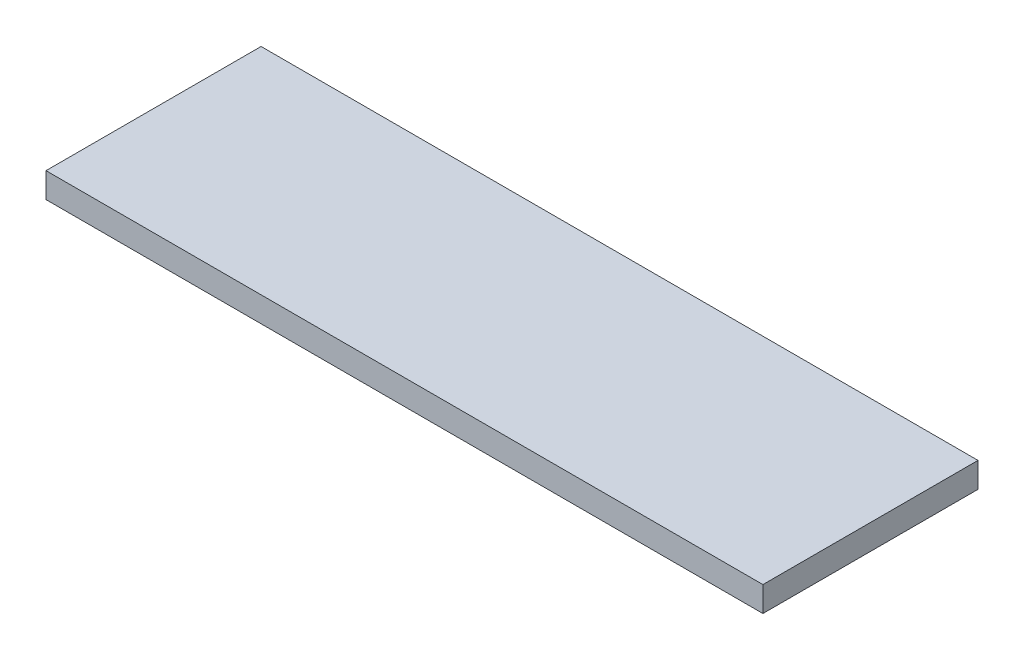
ISO-10303-21;
HEADER;
FILE_DESCRIPTION(('STEP AP214'),'2;1');
FILE_NAME('part.step','',(''),(''),'','','');
FILE_SCHEMA(('AUTOMOTIVE_DESIGN { 1 0 10303 214 1 1 1 1 }'));
ENDSEC;
DATA;
#1=APPLICATION_CONTEXT('core data for automotive mechanical design processes');
#2=APPLICATION_PROTOCOL_DEFINITION('international standard','automotive_design',2000,#1);
#3=PRODUCT_CONTEXT('',#1,'mechanical');
#4=PRODUCT('Part','Part','',(#3));
#5=PRODUCT_RELATED_PRODUCT_CATEGORY('part','',(#4));
#6=PRODUCT_DEFINITION_FORMATION('','',#4);
#7=PRODUCT_DEFINITION_CONTEXT('part definition',#1,'design');
#8=PRODUCT_DEFINITION('design','',#6,#7);
#9=PRODUCT_DEFINITION_SHAPE('','',#8);
#10=(LENGTH_UNIT() NAMED_UNIT(*) SI_UNIT(.MILLI.,.METRE.));
#11=(NAMED_UNIT(*) PLANE_ANGLE_UNIT() SI_UNIT($,.RADIAN.));
#12=(NAMED_UNIT(*) SI_UNIT($,.STERADIAN.) SOLID_ANGLE_UNIT());
#13=UNCERTAINTY_MEASURE_WITH_UNIT(LENGTH_MEASURE(1.E-05),#10,'distance_accuracy_value','');
#14=(GEOMETRIC_REPRESENTATION_CONTEXT(3) GLOBAL_UNCERTAINTY_ASSIGNED_CONTEXT((#13)) GLOBAL_UNIT_ASSIGNED_CONTEXT((#10,
#11,#12)) REPRESENTATION_CONTEXT('',''));
#15=CARTESIAN_POINT('',(0.,0.,0.));
#16=DIRECTION('',(0.,0.,1.));
#17=DIRECTION('',(1.,0.,0.));
#18=AXIS2_PLACEMENT_3D('',#15,#16,#17);
#19=CARTESIAN_POINT('',(63.5,2.2225,19.05));
#20=DIRECTION('',(-1.,0.,0.));
#21=DIRECTION('',(0.,0.,1.));
#22=AXIS2_PLACEMENT_3D('',#19,#20,#21);
#23=PLANE('',#22);
#24=DIRECTION('',(0.,0.,-1.));
#25=VECTOR('',#24,1.);
#26=CARTESIAN_POINT('',(63.5,-2.2225,19.05));
#27=LINE('',#26,#25);
#28=CARTESIAN_POINT('',(63.5,-2.2225,19.05));
#29=VERTEX_POINT('',#28);
#30=CARTESIAN_POINT('',(63.5,-2.2225,-19.05));
#31=VERTEX_POINT('',#30);
#32=EDGE_CURVE('E95',#29,#31,#27,.T.);
#33=ORIENTED_EDGE('',*,*,#32,.T.);
#34=DIRECTION('',(0.,-1.,0.));
#35=VECTOR('',#34,1.);
#36=CARTESIAN_POINT('',(63.5,2.2225,-19.05));
#37=LINE('',#36,#35);
#38=CARTESIAN_POINT('',(63.5,2.2225,-19.05));
#39=VERTEX_POINT('',#38);
#40=EDGE_CURVE('E11',#39,#31,#37,.T.);
#41=ORIENTED_EDGE('',*,*,#40,.F.);
#42=DIRECTION('',(0.,0.,-1.));
#43=VECTOR('',#42,1.);
#44=CARTESIAN_POINT('',(63.5,2.2225,19.05));
#45=LINE('',#44,#43);
#46=CARTESIAN_POINT('',(63.5,2.2225,19.05));
#47=VERTEX_POINT('',#46);
#48=EDGE_CURVE('E83',#47,#39,#45,.T.);
#49=ORIENTED_EDGE('',*,*,#48,.F.);
#50=DIRECTION('',(0.,-1.,0.));
#51=VECTOR('',#50,1.);
#52=CARTESIAN_POINT('',(63.5,2.2225,19.05));
#53=LINE('',#52,#51);
#54=EDGE_CURVE('E91',#47,#29,#53,.T.);
#55=ORIENTED_EDGE('',*,*,#54,.T.);
#56=EDGE_LOOP('',(#33,#41,#49,#55));
#57=FACE_BOUND('',#56,.T.);
#58=ADVANCED_FACE('F32',(#57),#23,.F.);
#59=CARTESIAN_POINT('',(-63.5,2.2225,-19.05));
#60=DIRECTION('',(0.,0.,1.));
#61=DIRECTION('',(1.,0.,0.));
#62=AXIS2_PLACEMENT_3D('',#59,#60,#61);
#63=PLANE('',#62);
#64=DIRECTION('',(-1.,0.,0.));
#65=VECTOR('',#64,1.);
#66=CARTESIAN_POINT('',(-63.5,-2.2225,-19.05));
#67=LINE('',#66,#65);
#68=CARTESIAN_POINT('',(-63.5,-2.2225,-19.05));
#69=VERTEX_POINT('',#68);
#70=EDGE_CURVE('E87',#31,#69,#67,.T.);
#71=ORIENTED_EDGE('',*,*,#70,.T.);
#72=DIRECTION('',(0.,-1.,0.));
#73=VECTOR('',#72,1.);
#74=CARTESIAN_POINT('',(-63.5,2.2225,-19.05));
#75=LINE('',#74,#73);
#76=CARTESIAN_POINT('',(-63.5,2.2225,-19.05));
#77=VERTEX_POINT('',#76);
#78=EDGE_CURVE('E40',#77,#69,#75,.T.);
#79=ORIENTED_EDGE('',*,*,#78,.F.);
#80=DIRECTION('',(-1.,0.,0.));
#81=VECTOR('',#80,1.);
#82=CARTESIAN_POINT('',(-63.5,2.2225,-19.05));
#83=LINE('',#82,#81);
#84=EDGE_CURVE('E78',#39,#77,#83,.T.);
#85=ORIENTED_EDGE('',*,*,#84,.F.);
#86=ORIENTED_EDGE('',*,*,#40,.T.);
#87=EDGE_LOOP('',(#71,#79,#85,#86));
#88=FACE_BOUND('',#87,.T.);
#89=ADVANCED_FACE('F86',(#88),#63,.F.);
#90=CARTESIAN_POINT('',(-63.5,2.2225,19.05));
#91=DIRECTION('',(1.,0.,0.));
#92=DIRECTION('',(0.,0.,-1.));
#93=AXIS2_PLACEMENT_3D('',#90,#91,#92);
#94=PLANE('',#93);
#95=DIRECTION('',(0.,0.,1.));
#96=VECTOR('',#95,1.);
#97=CARTESIAN_POINT('',(-63.5,-2.2225,19.05));
#98=LINE('',#97,#96);
#99=CARTESIAN_POINT('',(-63.5,-2.2225,19.05));
#100=VERTEX_POINT('',#99);
#101=EDGE_CURVE('E65',#69,#100,#98,.T.);
#102=ORIENTED_EDGE('',*,*,#101,.T.);
#103=DIRECTION('',(0.,-1.,0.));
#104=VECTOR('',#103,1.);
#105=CARTESIAN_POINT('',(-63.5,2.2225,19.05));
#106=LINE('',#105,#104);
#107=CARTESIAN_POINT('',(-63.5,2.2225,19.05));
#108=VERTEX_POINT('',#107);
#109=EDGE_CURVE('E88',#108,#100,#106,.T.);
#110=ORIENTED_EDGE('',*,*,#109,.F.);
#111=DIRECTION('',(0.,0.,1.));
#112=VECTOR('',#111,1.);
#113=CARTESIAN_POINT('',(-63.5,2.2225,19.05));
#114=LINE('',#113,#112);
#115=EDGE_CURVE('E81',#77,#108,#114,.T.);
#116=ORIENTED_EDGE('',*,*,#115,.F.);
#117=ORIENTED_EDGE('',*,*,#78,.T.);
#118=EDGE_LOOP('',(#102,#110,#116,#117));
#119=FACE_BOUND('',#118,.T.);
#120=ADVANCED_FACE('F89',(#119),#94,.F.);
#121=CARTESIAN_POINT('',(-63.5,2.2225,19.05));
#122=DIRECTION('',(0.,0.,-1.));
#123=DIRECTION('',(-1.,0.,0.));
#124=AXIS2_PLACEMENT_3D('',#121,#122,#123);
#125=PLANE('',#124);
#126=DIRECTION('',(1.,0.,0.));
#127=VECTOR('',#126,1.);
#128=CARTESIAN_POINT('',(-63.5,-2.2225,19.05));
#129=LINE('',#128,#127);
#130=EDGE_CURVE('E71',#100,#29,#129,.T.);
#131=ORIENTED_EDGE('',*,*,#130,.T.);
#132=ORIENTED_EDGE('',*,*,#54,.F.);
#133=DIRECTION('',(1.,0.,0.));
#134=VECTOR('',#133,1.);
#135=CARTESIAN_POINT('',(-63.5,2.2225,19.05));
#136=LINE('',#135,#134);
#137=EDGE_CURVE('E48',#108,#47,#136,.T.);
#138=ORIENTED_EDGE('',*,*,#137,.F.);
#139=ORIENTED_EDGE('',*,*,#109,.T.);
#140=EDGE_LOOP('',(#131,#132,#138,#139));
#141=FACE_BOUND('',#140,.T.);
#142=ADVANCED_FACE('F102',(#141),#125,.F.);
#143=CARTESIAN_POINT('',(0.,2.2225,0.));
#144=DIRECTION('',(0.,-1.,0.));
#145=DIRECTION('',(0.,0.,-1.));
#146=AXIS2_PLACEMENT_3D('',#143,#144,#145);
#147=PLANE('',#146);
#148=ORIENTED_EDGE('',*,*,#48,.T.);
#149=ORIENTED_EDGE('',*,*,#84,.T.);
#150=ORIENTED_EDGE('',*,*,#115,.T.);
#151=ORIENTED_EDGE('',*,*,#137,.T.);
#152=EDGE_LOOP('',(#148,#149,#150,#151));
#153=FACE_BOUND('',#152,.T.);
#154=ADVANCED_FACE('F79',(#153),#147,.F.);
#155=CARTESIAN_POINT('',(0.,-2.2225,0.));
#156=DIRECTION('',(0.,-1.,0.));
#157=DIRECTION('',(0.,0.,-1.));
#158=AXIS2_PLACEMENT_3D('',#155,#156,#157);
#159=PLANE('',#158);
#160=ORIENTED_EDGE('',*,*,#32,.F.);
#161=ORIENTED_EDGE('',*,*,#130,.F.);
#162=ORIENTED_EDGE('',*,*,#101,.F.);
#163=ORIENTED_EDGE('',*,*,#70,.F.);
#164=EDGE_LOOP('',(#160,#161,#162,#163));
#165=FACE_BOUND('',#164,.T.);
#166=ADVANCED_FACE('F105',(#165),#159,.T.);
#167=CLOSED_SHELL('',(#58,#89,#120,#142,#154,#166));
#168=MANIFOLD_SOLID_BREP('B2',#167);
#169=ADVANCED_BREP_SHAPE_REPRESENTATION('',(#18,#168),#14);
#170=SHAPE_DEFINITION_REPRESENTATION(#9,#169);
ENDSEC;
END-ISO-10303-21;
